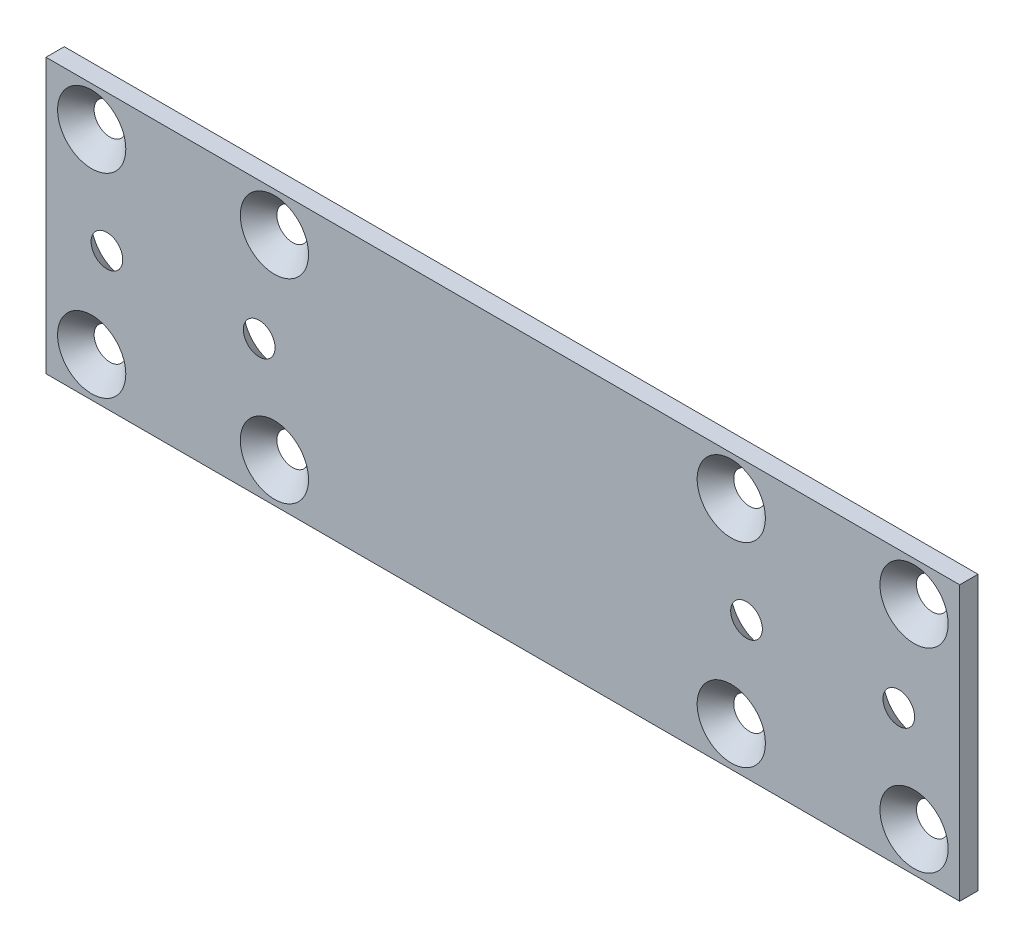
ISO-10303-21;
HEADER;
FILE_DESCRIPTION(('STEP AP214'),'2;1');
FILE_NAME('part.step','',(''),(''),'','','');
FILE_SCHEMA(('AUTOMOTIVE_DESIGN { 1 0 10303 214 1 1 1 1 }'));
ENDSEC;
DATA;
#1=APPLICATION_CONTEXT('core data for automotive mechanical design processes');
#2=APPLICATION_PROTOCOL_DEFINITION('international standard','automotive_design',2000,#1);
#3=PRODUCT_CONTEXT('',#1,'mechanical');
#4=PRODUCT('Part','Part','',(#3));
#5=PRODUCT_RELATED_PRODUCT_CATEGORY('part','',(#4));
#6=PRODUCT_DEFINITION_FORMATION('','',#4);
#7=PRODUCT_DEFINITION_CONTEXT('part definition',#1,'design');
#8=PRODUCT_DEFINITION('design','',#6,#7);
#9=PRODUCT_DEFINITION_SHAPE('','',#8);
#10=(LENGTH_UNIT() NAMED_UNIT(*) SI_UNIT(.MILLI.,.METRE.));
#11=(NAMED_UNIT(*) PLANE_ANGLE_UNIT() SI_UNIT($,.RADIAN.));
#12=(NAMED_UNIT(*) SI_UNIT($,.STERADIAN.) SOLID_ANGLE_UNIT());
#13=UNCERTAINTY_MEASURE_WITH_UNIT(LENGTH_MEASURE(1.E-05),#10,'distance_accuracy_value','');
#14=(GEOMETRIC_REPRESENTATION_CONTEXT(3) GLOBAL_UNCERTAINTY_ASSIGNED_CONTEXT((#13)) GLOBAL_UNIT_ASSIGNED_CONTEXT((#10,
#11,#12)) REPRESENTATION_CONTEXT('',''));
#15=CARTESIAN_POINT('',(0.,0.,0.));
#16=DIRECTION('',(0.,0.,1.));
#17=DIRECTION('',(1.,0.,0.));
#18=AXIS2_PLACEMENT_3D('',#15,#16,#17);
#19=CARTESIAN_POINT('',(0.,0.,1.5));
#20=DIRECTION('',(0.,0.,1.));
#21=DIRECTION('',(1.,0.,0.));
#22=AXIS2_PLACEMENT_3D('',#19,#20,#21);
#23=PLANE('',#22);
#24=CARTESIAN_POINT('',(40.,0.,1.50000000002137));
#25=DIRECTION('',(0.,0.,-1.));
#26=DIRECTION('',(-1.,0.,0.));
#27=AXIS2_PLACEMENT_3D('',#24,#25,#26);
#28=CIRCLE('',#27,2.60000000004993);
#29=CARTESIAN_POINT('',(37.3999999999501,0.,1.50000000002137));
#30=VERTEX_POINT('',#29);
#31=EDGE_CURVE('E116',#30,#30,#28,.T.);
#32=ORIENTED_EDGE('',*,*,#31,.T.);
#33=EDGE_LOOP('',(#32));
#34=FACE_BOUND('',#33,.T.);
#35=CARTESIAN_POINT('',(65.,0.,1.50000000007822));
#36=DIRECTION('',(0.,0.,-1.));
#37=DIRECTION('',(-1.,0.,0.));
#38=AXIS2_PLACEMENT_3D('',#35,#36,#37);
#39=CIRCLE('',#38,2.59999999997035);
#40=CARTESIAN_POINT('',(62.4000000000297,0.,1.50000000007822));
#41=VERTEX_POINT('',#40);
#42=EDGE_CURVE('E119',#41,#41,#39,.T.);
#43=ORIENTED_EDGE('',*,*,#42,.T.);
#44=EDGE_LOOP('',(#43));
#45=FACE_BOUND('',#44,.T.);
#46=CARTESIAN_POINT('',(-40.,0.,1.50000000000091));
#47=DIRECTION('',(0.,0.,-1.));
#48=DIRECTION('',(0.,1.,0.));
#49=AXIS2_PLACEMENT_3D('',#46,#47,#48);
#50=CIRCLE('',#49,2.59999999997262);
#51=CARTESIAN_POINT('',(-40.,2.59999999997262,1.50000000000091));
#52=VERTEX_POINT('',#51);
#53=EDGE_CURVE('E122',#52,#52,#50,.T.);
#54=ORIENTED_EDGE('',*,*,#53,.T.);
#55=EDGE_LOOP('',(#54));
#56=FACE_BOUND('',#55,.T.);
#57=CARTESIAN_POINT('',(-65.,0.,1.49999999996453));
#58=DIRECTION('',(0.,0.,-1.));
#59=DIRECTION('',(-1.,0.,0.));
#60=AXIS2_PLACEMENT_3D('',#57,#58,#59);
#61=CIRCLE('',#60,2.60000000003174);
#62=CARTESIAN_POINT('',(-67.6000000000317,0.,1.49999999996453));
#63=VERTEX_POINT('',#62);
#64=EDGE_CURVE('E125',#63,#63,#61,.T.);
#65=ORIENTED_EDGE('',*,*,#64,.T.);
#66=EDGE_LOOP('',(#65));
#67=FACE_BOUND('',#66,.T.);
#68=CARTESIAN_POINT('',(37.5,16.,1.49999999996453));
#69=DIRECTION('',(0.,0.,1.));
#70=DIRECTION('',(1.,0.,0.));
#71=AXIS2_PLACEMENT_3D('',#68,#69,#70);
#72=CIRCLE('',#71,5.59999999999263);
#73=CARTESIAN_POINT('',(43.0999999999926,16.,1.49999999996453));
#74=VERTEX_POINT('',#73);
#75=EDGE_CURVE('E128',#74,#74,#72,.F.);
#76=ORIENTED_EDGE('',*,*,#75,.T.);
#77=EDGE_LOOP('',(#76));
#78=FACE_BOUND('',#77,.T.);
#79=CARTESIAN_POINT('',(67.5,16.,1.49999999996453));
#80=DIRECTION('',(0.,0.,1.));
#81=DIRECTION('',(1.,0.,0.));
#82=AXIS2_PLACEMENT_3D('',#79,#80,#81);
#83=CIRCLE('',#82,5.59999999996308);
#84=CARTESIAN_POINT('',(73.0999999999631,16.,1.49999999996453));
#85=VERTEX_POINT('',#84);
#86=EDGE_CURVE('E131',#85,#85,#83,.F.);
#87=ORIENTED_EDGE('',*,*,#86,.T.);
#88=EDGE_LOOP('',(#87));
#89=FACE_BOUND('',#88,.T.);
#90=CARTESIAN_POINT('',(37.5,-16.,1.49999999996453));
#91=DIRECTION('',(0.,0.,1.));
#92=DIRECTION('',(1.,0.,0.));
#93=AXIS2_PLACEMENT_3D('',#90,#91,#92);
#94=CIRCLE('',#93,5.59999999999263);
#95=CARTESIAN_POINT('',(43.0999999999926,-16.,1.49999999996453));
#96=VERTEX_POINT('',#95);
#97=EDGE_CURVE('E134',#96,#96,#94,.F.);
#98=ORIENTED_EDGE('',*,*,#97,.T.);
#99=EDGE_LOOP('',(#98));
#100=FACE_BOUND('',#99,.T.);
#101=CARTESIAN_POINT('',(67.5,-16.,1.49999999996453));
#102=DIRECTION('',(0.,0.,1.));
#103=DIRECTION('',(1.,0.,0.));
#104=AXIS2_PLACEMENT_3D('',#101,#102,#103);
#105=CIRCLE('',#104,5.59999999996308);
#106=CARTESIAN_POINT('',(73.0999999999631,-16.,1.49999999996453));
#107=VERTEX_POINT('',#106);
#108=EDGE_CURVE('E137',#107,#107,#105,.F.);
#109=ORIENTED_EDGE('',*,*,#108,.T.);
#110=EDGE_LOOP('',(#109));
#111=FACE_BOUND('',#110,.T.);
#112=CARTESIAN_POINT('',(-37.5,16.,1.49999999996453));
#113=DIRECTION('',(0.,0.,1.));
#114=DIRECTION('',(1.,0.,0.));
#115=AXIS2_PLACEMENT_3D('',#112,#113,#114);
#116=CIRCLE('',#115,5.60000000003811);
#117=CARTESIAN_POINT('',(-31.8999999999619,16.,1.49999999996453));
#118=VERTEX_POINT('',#117);
#119=EDGE_CURVE('E140',#118,#118,#116,.F.);
#120=ORIENTED_EDGE('',*,*,#119,.T.);
#121=EDGE_LOOP('',(#120));
#122=FACE_BOUND('',#121,.T.);
#123=CARTESIAN_POINT('',(-67.5,16.,1.49999999996453));
#124=DIRECTION('',(0.,0.,1.));
#125=DIRECTION('',(1.,0.,0.));
#126=AXIS2_PLACEMENT_3D('',#123,#124,#125);
#127=CIRCLE('',#126,5.60000000001082);
#128=CARTESIAN_POINT('',(-61.8999999999892,16.,1.49999999996453));
#129=VERTEX_POINT('',#128);
#130=EDGE_CURVE('E143',#129,#129,#127,.F.);
#131=ORIENTED_EDGE('',*,*,#130,.T.);
#132=EDGE_LOOP('',(#131));
#133=FACE_BOUND('',#132,.T.);
#134=CARTESIAN_POINT('',(-37.5,-16.,1.49999999996453));
#135=DIRECTION('',(0.,0.,1.));
#136=DIRECTION('',(1.,0.,0.));
#137=AXIS2_PLACEMENT_3D('',#134,#135,#136);
#138=CIRCLE('',#137,5.60000000003811);
#139=CARTESIAN_POINT('',(-31.8999999999619,-16.,1.49999999996453));
#140=VERTEX_POINT('',#139);
#141=EDGE_CURVE('E145',#140,#140,#138,.F.);
#142=ORIENTED_EDGE('',*,*,#141,.T.);
#143=EDGE_LOOP('',(#142));
#144=FACE_BOUND('',#143,.T.);
#145=CARTESIAN_POINT('',(-67.5,-16.,1.49999999996453));
#146=DIRECTION('',(0.,0.,1.));
#147=DIRECTION('',(1.,0.,0.));
#148=AXIS2_PLACEMENT_3D('',#145,#146,#147);
#149=CIRCLE('',#148,5.60000000001082);
#150=CARTESIAN_POINT('',(-61.8999999999892,-16.,1.49999999996453));
#151=VERTEX_POINT('',#150);
#152=EDGE_CURVE('E20',#151,#151,#149,.F.);
#153=ORIENTED_EDGE('',*,*,#152,.T.);
#154=EDGE_LOOP('',(#153));
#155=FACE_BOUND('',#154,.T.);
#156=DIRECTION('',(1.,0.,0.));
#157=VECTOR('',#156,1.);
#158=CARTESIAN_POINT('',(75.,22.5,1.5));
#159=LINE('',#158,#157);
#160=CARTESIAN_POINT('',(-75.,22.5,1.5));
#161=VERTEX_POINT('',#160);
#162=CARTESIAN_POINT('',(75.,22.5,1.5));
#163=VERTEX_POINT('',#162);
#164=EDGE_CURVE('E71',#161,#163,#159,.T.);
#165=ORIENTED_EDGE('',*,*,#164,.F.);
#166=DIRECTION('',(0.,1.,0.));
#167=VECTOR('',#166,1.);
#168=CARTESIAN_POINT('',(-75.,22.5,1.5));
#169=LINE('',#168,#167);
#170=CARTESIAN_POINT('',(-75.,-22.5,1.5));
#171=VERTEX_POINT('',#170);
#172=EDGE_CURVE('E68',#171,#161,#169,.T.);
#173=ORIENTED_EDGE('',*,*,#172,.F.);
#174=DIRECTION('',(1.,0.,0.));
#175=VECTOR('',#174,1.);
#176=CARTESIAN_POINT('',(-75.,-22.5,1.5));
#177=LINE('',#176,#175);
#178=CARTESIAN_POINT('',(75.,-22.5,1.5));
#179=VERTEX_POINT('',#178);
#180=EDGE_CURVE('E59',#179,#171,#177,.F.);
#181=ORIENTED_EDGE('',*,*,#180,.F.);
#182=DIRECTION('',(0.,1.,0.));
#183=VECTOR('',#182,1.);
#184=CARTESIAN_POINT('',(75.,-22.5,1.5));
#185=LINE('',#184,#183);
#186=EDGE_CURVE('E54',#163,#179,#185,.F.);
#187=ORIENTED_EDGE('',*,*,#186,.F.);
#188=EDGE_LOOP('',(#165,#173,#181,#187));
#189=FACE_BOUND('',#188,.T.);
#190=ADVANCED_FACE('F17',(#34,#45,#56,#67,#78,#89,#100,#111,#122,#133,#144,#155,#189),#23,.T.);
#191=CARTESIAN_POINT('',(-75.,22.5,-1.5));
#192=DIRECTION('',(-1.,0.,0.));
#193=DIRECTION('',(0.,0.,1.));
#194=AXIS2_PLACEMENT_3D('',#191,#192,#193);
#195=PLANE('',#194);
#196=DIRECTION('',(0.,0.,1.));
#197=VECTOR('',#196,1.);
#198=CARTESIAN_POINT('',(-75.,22.5,-1.5));
#199=LINE('',#198,#197);
#200=CARTESIAN_POINT('',(-75.,22.5,-1.5));
#201=VERTEX_POINT('',#200);
#202=EDGE_CURVE('E153',#201,#161,#199,.T.);
#203=ORIENTED_EDGE('',*,*,#202,.F.);
#204=DIRECTION('',(0.,1.,0.));
#205=VECTOR('',#204,1.);
#206=CARTESIAN_POINT('',(-75.,0.,-1.5));
#207=LINE('',#206,#205);
#208=CARTESIAN_POINT('',(-75.,-22.5,-1.5));
#209=VERTEX_POINT('',#208);
#210=EDGE_CURVE('E78',#201,#209,#207,.F.);
#211=ORIENTED_EDGE('',*,*,#210,.T.);
#212=DIRECTION('',(0.,0.,-1.));
#213=VECTOR('',#212,1.);
#214=CARTESIAN_POINT('',(-75.,-22.5,-1.5));
#215=LINE('',#214,#213);
#216=EDGE_CURVE('E64',#171,#209,#215,.T.);
#217=ORIENTED_EDGE('',*,*,#216,.F.);
#218=ORIENTED_EDGE('',*,*,#172,.T.);
#219=EDGE_LOOP('',(#203,#211,#217,#218));
#220=FACE_BOUND('',#219,.T.);
#221=ADVANCED_FACE('F77',(#220),#195,.T.);
#222=CARTESIAN_POINT('',(-75.,-22.5,-1.5));
#223=DIRECTION('',(0.,-1.,0.));
#224=DIRECTION('',(0.,0.,-1.));
#225=AXIS2_PLACEMENT_3D('',#222,#223,#224);
#226=PLANE('',#225);
#227=ORIENTED_EDGE('',*,*,#216,.T.);
#228=DIRECTION('',(1.,0.,0.));
#229=VECTOR('',#228,1.);
#230=CARTESIAN_POINT('',(0.,-22.5,-1.5));
#231=LINE('',#230,#229);
#232=CARTESIAN_POINT('',(75.,-22.5,-1.5));
#233=VERTEX_POINT('',#232);
#234=EDGE_CURVE('E164',#209,#233,#231,.T.);
#235=ORIENTED_EDGE('',*,*,#234,.T.);
#236=DIRECTION('',(0.,0.,-1.));
#237=VECTOR('',#236,1.);
#238=CARTESIAN_POINT('',(75.,-22.5,-1.5));
#239=LINE('',#238,#237);
#240=EDGE_CURVE('E66',#179,#233,#239,.T.);
#241=ORIENTED_EDGE('',*,*,#240,.F.);
#242=ORIENTED_EDGE('',*,*,#180,.T.);
#243=EDGE_LOOP('',(#227,#235,#241,#242));
#244=FACE_BOUND('',#243,.T.);
#245=ADVANCED_FACE('F61',(#244),#226,.T.);
#246=CARTESIAN_POINT('',(75.,-22.5,-1.5));
#247=DIRECTION('',(1.,0.,0.));
#248=DIRECTION('',(0.,0.,-1.));
#249=AXIS2_PLACEMENT_3D('',#246,#247,#248);
#250=PLANE('',#249);
#251=ORIENTED_EDGE('',*,*,#240,.T.);
#252=DIRECTION('',(0.,1.,0.));
#253=VECTOR('',#252,1.);
#254=CARTESIAN_POINT('',(75.,0.,-1.5));
#255=LINE('',#254,#253);
#256=CARTESIAN_POINT('',(75.,22.5,-1.5));
#257=VERTEX_POINT('',#256);
#258=EDGE_CURVE('E161',#233,#257,#255,.T.);
#259=ORIENTED_EDGE('',*,*,#258,.T.);
#260=DIRECTION('',(0.,0.,1.));
#261=VECTOR('',#260,1.);
#262=CARTESIAN_POINT('',(75.,22.5,-1.5));
#263=LINE('',#262,#261);
#264=EDGE_CURVE('E35',#163,#257,#263,.F.);
#265=ORIENTED_EDGE('',*,*,#264,.F.);
#266=ORIENTED_EDGE('',*,*,#186,.T.);
#267=EDGE_LOOP('',(#251,#259,#265,#266));
#268=FACE_BOUND('',#267,.T.);
#269=ADVANCED_FACE('F160',(#268),#250,.T.);
#270=CARTESIAN_POINT('',(75.,22.5,-1.5));
#271=DIRECTION('',(0.,1.,0.));
#272=DIRECTION('',(0.,0.,1.));
#273=AXIS2_PLACEMENT_3D('',#270,#271,#272);
#274=PLANE('',#273);
#275=ORIENTED_EDGE('',*,*,#264,.T.);
#276=DIRECTION('',(1.,0.,0.));
#277=VECTOR('',#276,1.);
#278=CARTESIAN_POINT('',(0.,22.5,-1.5));
#279=LINE('',#278,#277);
#280=EDGE_CURVE('E115',#257,#201,#279,.F.);
#281=ORIENTED_EDGE('',*,*,#280,.T.);
#282=ORIENTED_EDGE('',*,*,#202,.T.);
#283=ORIENTED_EDGE('',*,*,#164,.T.);
#284=EDGE_LOOP('',(#275,#281,#282,#283));
#285=FACE_BOUND('',#284,.T.);
#286=ADVANCED_FACE('F167',(#285),#274,.T.);
#287=CARTESIAN_POINT('',(-67.5,-16.,1.49999999990769));
#288=DIRECTION('',(0.,0.,1.));
#289=DIRECTION('',(1.,0.,0.));
#290=AXIS2_PLACEMENT_3D('',#287,#288,#289);
#291=CONICAL_SURFACE('',#290,5.59999999995398,0.785398163397448);
#292=ORIENTED_EDGE('',*,*,#152,.F.);
#293=EDGE_LOOP('',(#292));
#294=FACE_BOUND('',#293,.T.);
#295=CARTESIAN_POINT('',(-67.5,-16.,-1.50000000002137));
#296=DIRECTION('',(0.,0.,1.));
#297=DIRECTION('',(1.,0.,0.));
#298=AXIS2_PLACEMENT_3D('',#295,#296,#297);
#299=CIRCLE('',#298,2.60000000002492);
#300=CARTESIAN_POINT('',(-64.8999999999751,-16.,-1.50000000002137));
#301=VERTEX_POINT('',#300);
#302=EDGE_CURVE('E112',#301,#301,#299,.F.);
#303=ORIENTED_EDGE('',*,*,#302,.T.);
#304=EDGE_LOOP('',(#303));
#305=FACE_BOUND('',#304,.T.);
#306=ADVANCED_FACE('F169',(#294,#305),#291,.F.);
#307=CARTESIAN_POINT('',(-37.5,-16.,1.49999999996453));
#308=DIRECTION('',(0.,0.,1.));
#309=DIRECTION('',(1.,0.,0.));
#310=AXIS2_PLACEMENT_3D('',#307,#308,#309);
#311=CONICAL_SURFACE('',#310,5.60000000003811,0.785398163397448);
#312=ORIENTED_EDGE('',*,*,#141,.F.);
#313=EDGE_LOOP('',(#312));
#314=FACE_BOUND('',#313,.T.);
#315=CARTESIAN_POINT('',(-37.5,-16.,-1.50000000002137));
#316=DIRECTION('',(0.,0.,1.));
#317=DIRECTION('',(1.,0.,0.));
#318=AXIS2_PLACEMENT_3D('',#315,#316,#317);
#319=CIRCLE('',#318,2.60000000005221);
#320=CARTESIAN_POINT('',(-34.8999999999478,-16.,-1.50000000002137));
#321=VERTEX_POINT('',#320);
#322=EDGE_CURVE('E109',#321,#321,#319,.F.);
#323=ORIENTED_EDGE('',*,*,#322,.T.);
#324=EDGE_LOOP('',(#323));
#325=FACE_BOUND('',#324,.T.);
#326=ADVANCED_FACE('F176',(#314,#325),#311,.F.);
#327=CARTESIAN_POINT('',(-67.5,16.,1.49999999990769));
#328=DIRECTION('',(0.,0.,1.));
#329=DIRECTION('',(1.,0.,0.));
#330=AXIS2_PLACEMENT_3D('',#327,#328,#329);
#331=CONICAL_SURFACE('',#330,5.59999999995398,0.785398163397448);
#332=ORIENTED_EDGE('',*,*,#130,.F.);
#333=EDGE_LOOP('',(#332));
#334=FACE_BOUND('',#333,.T.);
#335=CARTESIAN_POINT('',(-67.5,16.,-1.50000000002137));
#336=DIRECTION('',(0.,0.,1.));
#337=DIRECTION('',(1.,0.,0.));
#338=AXIS2_PLACEMENT_3D('',#335,#336,#337);
#339=CIRCLE('',#338,2.60000000002492);
#340=CARTESIAN_POINT('',(-64.8999999999751,16.,-1.50000000002137));
#341=VERTEX_POINT('',#340);
#342=EDGE_CURVE('E106',#341,#341,#339,.F.);
#343=ORIENTED_EDGE('',*,*,#342,.T.);
#344=EDGE_LOOP('',(#343));
#345=FACE_BOUND('',#344,.T.);
#346=ADVANCED_FACE('F223',(#334,#345),#331,.F.);
#347=CARTESIAN_POINT('',(-37.5,16.,1.49999999996453));
#348=DIRECTION('',(0.,0.,1.));
#349=DIRECTION('',(1.,0.,0.));
#350=AXIS2_PLACEMENT_3D('',#347,#348,#349);
#351=CONICAL_SURFACE('',#350,5.60000000003811,0.785398163397448);
#352=ORIENTED_EDGE('',*,*,#119,.F.);
#353=EDGE_LOOP('',(#352));
#354=FACE_BOUND('',#353,.T.);
#355=CARTESIAN_POINT('',(-37.5,16.,-1.50000000002137));
#356=DIRECTION('',(0.,0.,1.));
#357=DIRECTION('',(1.,0.,0.));
#358=AXIS2_PLACEMENT_3D('',#355,#356,#357);
#359=CIRCLE('',#358,2.60000000005221);
#360=CARTESIAN_POINT('',(-34.8999999999478,16.,-1.50000000002137));
#361=VERTEX_POINT('',#360);
#362=EDGE_CURVE('E103',#361,#361,#359,.F.);
#363=ORIENTED_EDGE('',*,*,#362,.T.);
#364=EDGE_LOOP('',(#363));
#365=FACE_BOUND('',#364,.T.);
#366=ADVANCED_FACE('F219',(#354,#365),#351,.F.);
#367=CARTESIAN_POINT('',(67.5,-16.,1.49999999990769));
#368=DIRECTION('',(0.,0.,1.));
#369=DIRECTION('',(1.,0.,0.));
#370=AXIS2_PLACEMENT_3D('',#367,#368,#369);
#371=CONICAL_SURFACE('',#370,5.59999999990624,0.785398163387974);
#372=CARTESIAN_POINT('',(67.5,-16.,-1.50000000002137));
#373=DIRECTION('',(0.,0.,1.));
#374=DIRECTION('',(1.,0.,0.));
#375=AXIS2_PLACEMENT_3D('',#372,#373,#374);
#376=CIRCLE('',#375,2.60000000003402);
#377=CARTESIAN_POINT('',(70.100000000034,-16.,-1.50000000002137));
#378=VERTEX_POINT('',#377);
#379=EDGE_CURVE('E100',#378,#378,#376,.F.);
#380=ORIENTED_EDGE('',*,*,#379,.T.);
#381=EDGE_LOOP('',(#380));
#382=FACE_BOUND('',#381,.T.);
#383=ORIENTED_EDGE('',*,*,#108,.F.);
#384=EDGE_LOOP('',(#383));
#385=FACE_BOUND('',#384,.T.);
#386=ADVANCED_FACE('F215',(#382,#385),#371,.F.);
#387=CARTESIAN_POINT('',(37.5,-16.,1.49999999996453));
#388=DIRECTION('',(0.,0.,1.));
#389=DIRECTION('',(1.,0.,0.));
#390=AXIS2_PLACEMENT_3D('',#387,#388,#389);
#391=CONICAL_SURFACE('',#390,5.59999999999263,0.785398163387974);
#392=CARTESIAN_POINT('',(37.5,-16.,-1.50000000007822));
#393=DIRECTION('',(0.,0.,1.));
#394=DIRECTION('',(1.,0.,0.));
#395=AXIS2_PLACEMENT_3D('',#392,#393,#394);
#396=CIRCLE('',#395,2.60000000000673);
#397=CARTESIAN_POINT('',(40.1000000000067,-16.,-1.50000000007822));
#398=VERTEX_POINT('',#397);
#399=EDGE_CURVE('E97',#398,#398,#396,.F.);
#400=ORIENTED_EDGE('',*,*,#399,.T.);
#401=EDGE_LOOP('',(#400));
#402=FACE_BOUND('',#401,.T.);
#403=ORIENTED_EDGE('',*,*,#97,.F.);
#404=EDGE_LOOP('',(#403));
#405=FACE_BOUND('',#404,.T.);
#406=ADVANCED_FACE('F211',(#402,#405),#391,.F.);
#407=CARTESIAN_POINT('',(67.5,16.,1.49999999990769));
#408=DIRECTION('',(0.,0.,1.));
#409=DIRECTION('',(1.,0.,0.));
#410=AXIS2_PLACEMENT_3D('',#407,#408,#409);
#411=CONICAL_SURFACE('',#410,5.59999999990624,0.785398163387974);
#412=CARTESIAN_POINT('',(67.5,16.,-1.50000000002137));
#413=DIRECTION('',(0.,0.,1.));
#414=DIRECTION('',(1.,0.,0.));
#415=AXIS2_PLACEMENT_3D('',#412,#413,#414);
#416=CIRCLE('',#415,2.60000000003402);
#417=CARTESIAN_POINT('',(70.100000000034,16.,-1.50000000002137));
#418=VERTEX_POINT('',#417);
#419=EDGE_CURVE('E94',#418,#418,#416,.F.);
#420=ORIENTED_EDGE('',*,*,#419,.T.);
#421=EDGE_LOOP('',(#420));
#422=FACE_BOUND('',#421,.T.);
#423=ORIENTED_EDGE('',*,*,#86,.F.);
#424=EDGE_LOOP('',(#423));
#425=FACE_BOUND('',#424,.T.);
#426=ADVANCED_FACE('F207',(#422,#425),#411,.F.);
#427=CARTESIAN_POINT('',(37.5,16.,1.49999999996453));
#428=DIRECTION('',(0.,0.,1.));
#429=DIRECTION('',(1.,0.,0.));
#430=AXIS2_PLACEMENT_3D('',#427,#428,#429);
#431=CONICAL_SURFACE('',#430,5.59999999999263,0.785398163387974);
#432=CARTESIAN_POINT('',(37.5,16.,-1.50000000007822));
#433=DIRECTION('',(0.,0.,1.));
#434=DIRECTION('',(1.,0.,0.));
#435=AXIS2_PLACEMENT_3D('',#432,#433,#434);
#436=CIRCLE('',#435,2.60000000000673);
#437=CARTESIAN_POINT('',(40.1000000000067,16.,-1.50000000007822));
#438=VERTEX_POINT('',#437);
#439=EDGE_CURVE('E91',#438,#438,#436,.F.);
#440=ORIENTED_EDGE('',*,*,#439,.T.);
#441=EDGE_LOOP('',(#440));
#442=FACE_BOUND('',#441,.T.);
#443=ORIENTED_EDGE('',*,*,#75,.F.);
#444=EDGE_LOOP('',(#443));
#445=FACE_BOUND('',#444,.T.);
#446=ADVANCED_FACE('F203',(#442,#445),#431,.F.);
#447=CARTESIAN_POINT('',(-65.,0.,-1.49999999996453));
#448=DIRECTION('',(0.,0.,-1.));
#449=DIRECTION('',(-1.,0.,0.));
#450=AXIS2_PLACEMENT_3D('',#447,#448,#449);
#451=CONICAL_SURFACE('',#450,5.5999999999608,0.785398163397448);
#452=CARTESIAN_POINT('',(-65.,0.,-1.49999999996453));
#453=DIRECTION('',(0.,0.,-1.));
#454=DIRECTION('',(-1.,0.,0.));
#455=AXIS2_PLACEMENT_3D('',#452,#453,#454);
#456=CIRCLE('',#455,5.5999999999608);
#457=CARTESIAN_POINT('',(-70.5999999999608,0.,-1.49999999996453));
#458=VERTEX_POINT('',#457);
#459=EDGE_CURVE('E88',#458,#458,#456,.T.);
#460=ORIENTED_EDGE('',*,*,#459,.T.);
#461=EDGE_LOOP('',(#460));
#462=FACE_BOUND('',#461,.T.);
#463=ORIENTED_EDGE('',*,*,#64,.F.);
#464=EDGE_LOOP('',(#463));
#465=FACE_BOUND('',#464,.T.);
#466=ADVANCED_FACE('F199',(#462,#465),#451,.F.);
#467=CARTESIAN_POINT('',(-40.,0.,-1.50000000002137));
#468=DIRECTION('',(0.,0.,-1.));
#469=DIRECTION('',(0.,1.,0.));
#470=AXIS2_PLACEMENT_3D('',#467,#468,#469);
#471=CONICAL_SURFACE('',#470,5.60000000005175,0.785398163406922);
#472=CARTESIAN_POINT('',(-40.,0.,-1.49999999998499));
#473=DIRECTION('',(0.,0.,-1.));
#474=DIRECTION('',(0.,1.,0.));
#475=AXIS2_PLACEMENT_3D('',#472,#473,#474);
#476=CIRCLE('',#475,5.60000000001537);
#477=CARTESIAN_POINT('',(-40.,5.60000000001537,-1.49999999998499));
#478=VERTEX_POINT('',#477);
#479=EDGE_CURVE('E85',#478,#478,#476,.T.);
#480=ORIENTED_EDGE('',*,*,#479,.T.);
#481=EDGE_LOOP('',(#480));
#482=FACE_BOUND('',#481,.T.);
#483=ORIENTED_EDGE('',*,*,#53,.F.);
#484=EDGE_LOOP('',(#483));
#485=FACE_BOUND('',#484,.T.);
#486=ADVANCED_FACE('F195',(#482,#485),#471,.F.);
#487=CARTESIAN_POINT('',(65.,0.,-1.49999999990769));
#488=DIRECTION('',(0.,0.,-1.));
#489=DIRECTION('',(-1.,0.,0.));
#490=AXIS2_PLACEMENT_3D('',#487,#488,#489);
#491=CONICAL_SURFACE('',#490,5.59999999995625,0.785398163397448);
#492=ORIENTED_EDGE('',*,*,#42,.F.);
#493=EDGE_LOOP('',(#492));
#494=FACE_BOUND('',#493,.T.);
#495=CARTESIAN_POINT('',(65.,0.,-1.49999999996453));
#496=DIRECTION('',(0.,0.,-1.));
#497=DIRECTION('',(-1.,0.,0.));
#498=AXIS2_PLACEMENT_3D('',#495,#496,#497);
#499=CIRCLE('',#498,5.60000000001309);
#500=CARTESIAN_POINT('',(59.3999999999869,0.,-1.49999999996453));
#501=VERTEX_POINT('',#500);
#502=EDGE_CURVE('E26',#501,#501,#499,.T.);
#503=ORIENTED_EDGE('',*,*,#502,.T.);
#504=EDGE_LOOP('',(#503));
#505=FACE_BOUND('',#504,.T.);
#506=ADVANCED_FACE('F187',(#494,#505),#491,.F.);
#507=CARTESIAN_POINT('',(40.,0.,-1.49999999990769));
#508=DIRECTION('',(0.,0.,-1.));
#509=DIRECTION('',(-1.,0.,0.));
#510=AXIS2_PLACEMENT_3D('',#507,#508,#509);
#511=CONICAL_SURFACE('',#510,5.59999999997899,0.785398163397448);
#512=ORIENTED_EDGE('',*,*,#31,.F.);
#513=EDGE_LOOP('',(#512));
#514=FACE_BOUND('',#513,.T.);
#515=CARTESIAN_POINT('',(40.,0.,-1.49999999990769));
#516=DIRECTION('',(0.,0.,-1.));
#517=DIRECTION('',(-1.,0.,0.));
#518=AXIS2_PLACEMENT_3D('',#515,#516,#517);
#519=CIRCLE('',#518,5.59999999997899);
#520=CARTESIAN_POINT('',(34.400000000021,0.,-1.49999999990769));
#521=VERTEX_POINT('',#520);
#522=EDGE_CURVE('E11',#521,#521,#519,.T.);
#523=ORIENTED_EDGE('',*,*,#522,.T.);
#524=EDGE_LOOP('',(#523));
#525=FACE_BOUND('',#524,.T.);
#526=ADVANCED_FACE('F181',(#514,#525),#511,.F.);
#527=CARTESIAN_POINT('',(0.,0.,-1.5));
#528=DIRECTION('',(0.,0.,1.));
#529=DIRECTION('',(1.,0.,0.));
#530=AXIS2_PLACEMENT_3D('',#527,#528,#529);
#531=PLANE('',#530);
#532=ORIENTED_EDGE('',*,*,#522,.F.);
#533=EDGE_LOOP('',(#532));
#534=FACE_BOUND('',#533,.T.);
#535=ORIENTED_EDGE('',*,*,#502,.F.);
#536=EDGE_LOOP('',(#535));
#537=FACE_BOUND('',#536,.T.);
#538=ORIENTED_EDGE('',*,*,#479,.F.);
#539=EDGE_LOOP('',(#538));
#540=FACE_BOUND('',#539,.T.);
#541=ORIENTED_EDGE('',*,*,#459,.F.);
#542=EDGE_LOOP('',(#541));
#543=FACE_BOUND('',#542,.T.);
#544=ORIENTED_EDGE('',*,*,#439,.F.);
#545=EDGE_LOOP('',(#544));
#546=FACE_BOUND('',#545,.T.);
#547=ORIENTED_EDGE('',*,*,#419,.F.);
#548=EDGE_LOOP('',(#547));
#549=FACE_BOUND('',#548,.T.);
#550=ORIENTED_EDGE('',*,*,#399,.F.);
#551=EDGE_LOOP('',(#550));
#552=FACE_BOUND('',#551,.T.);
#553=ORIENTED_EDGE('',*,*,#379,.F.);
#554=EDGE_LOOP('',(#553));
#555=FACE_BOUND('',#554,.T.);
#556=ORIENTED_EDGE('',*,*,#362,.F.);
#557=EDGE_LOOP('',(#556));
#558=FACE_BOUND('',#557,.T.);
#559=ORIENTED_EDGE('',*,*,#342,.F.);
#560=EDGE_LOOP('',(#559));
#561=FACE_BOUND('',#560,.T.);
#562=ORIENTED_EDGE('',*,*,#322,.F.);
#563=EDGE_LOOP('',(#562));
#564=FACE_BOUND('',#563,.T.);
#565=ORIENTED_EDGE('',*,*,#302,.F.);
#566=EDGE_LOOP('',(#565));
#567=FACE_BOUND('',#566,.T.);
#568=ORIENTED_EDGE('',*,*,#258,.F.);
#569=ORIENTED_EDGE('',*,*,#234,.F.);
#570=ORIENTED_EDGE('',*,*,#210,.F.);
#571=ORIENTED_EDGE('',*,*,#280,.F.);
#572=EDGE_LOOP('',(#568,#569,#570,#571));
#573=FACE_BOUND('',#572,.T.);
#574=ADVANCED_FACE('F163',(#534,#537,#540,#543,#546,#549,#552,#555,#558,#561,#564,#567,#573),
#531,.F.);
#575=CLOSED_SHELL('',(#190,#221,#245,#269,#286,#306,#326,#346,#366,#386,#406,#426,#446,#466,
#486,#506,#526,#574));
#576=MANIFOLD_SOLID_BREP('B1',#575);
#577=ADVANCED_BREP_SHAPE_REPRESENTATION('',(#18,#576),#14);
#578=SHAPE_DEFINITION_REPRESENTATION(#9,#577);
ENDSEC;
END-ISO-10303-21;
